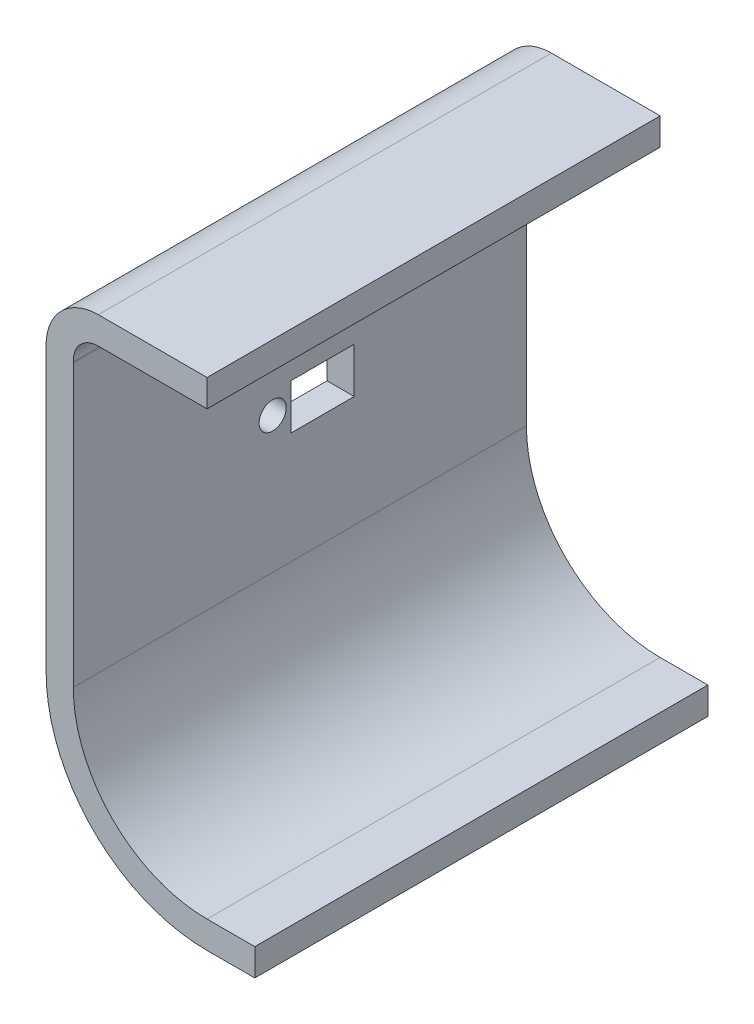
ISO-10303-21;
HEADER;
FILE_DESCRIPTION(('STEP AP214'),'2;1');
FILE_NAME('part.step','',(''),(''),'','','');
FILE_SCHEMA(('AUTOMOTIVE_DESIGN { 1 0 10303 214 1 1 1 1 }'));
ENDSEC;
DATA;
#1=APPLICATION_CONTEXT('core data for automotive mechanical design processes');
#2=APPLICATION_PROTOCOL_DEFINITION('international standard','automotive_design',2000,#1);
#3=PRODUCT_CONTEXT('',#1,'mechanical');
#4=PRODUCT('Part','Part','',(#3));
#5=PRODUCT_RELATED_PRODUCT_CATEGORY('part','',(#4));
#6=PRODUCT_DEFINITION_FORMATION('','',#4);
#7=PRODUCT_DEFINITION_CONTEXT('part definition',#1,'design');
#8=PRODUCT_DEFINITION('design','',#6,#7);
#9=PRODUCT_DEFINITION_SHAPE('','',#8);
#10=(LENGTH_UNIT() NAMED_UNIT(*) SI_UNIT(.MILLI.,.METRE.));
#11=(NAMED_UNIT(*) PLANE_ANGLE_UNIT() SI_UNIT($,.RADIAN.));
#12=(NAMED_UNIT(*) SI_UNIT($,.STERADIAN.) SOLID_ANGLE_UNIT());
#13=UNCERTAINTY_MEASURE_WITH_UNIT(LENGTH_MEASURE(1.E-05),#10,'distance_accuracy_value','');
#14=(GEOMETRIC_REPRESENTATION_CONTEXT(3) GLOBAL_UNCERTAINTY_ASSIGNED_CONTEXT((#13)) GLOBAL_UNIT_ASSIGNED_CONTEXT((#10,
#11,#12)) REPRESENTATION_CONTEXT('',''));
#15=CARTESIAN_POINT('',(0.,0.,0.));
#16=DIRECTION('',(0.,0.,1.));
#17=DIRECTION('',(1.,0.,0.));
#18=AXIS2_PLACEMENT_3D('',#15,#16,#17);
#19=CARTESIAN_POINT('',(-1.5,0.,50.));
#20=DIRECTION('',(-1.,0.,0.));
#21=DIRECTION('',(0.,0.,1.));
#22=AXIS2_PLACEMENT_3D('',#19,#20,#21);
#23=PLANE('',#22);
#24=DIRECTION('',(0.,-1.,0.));
#25=VECTOR('',#24,1.);
#26=CARTESIAN_POINT('',(-1.5,5.8,20.));
#27=LINE('',#26,#25);
#28=CARTESIAN_POINT('',(-1.5,10.8,20.));
#29=VERTEX_POINT('',#28);
#30=CARTESIAN_POINT('',(-1.5,5.8,20.));
#31=VERTEX_POINT('',#30);
#32=EDGE_CURVE('E49',#29,#31,#27,.T.);
#33=ORIENTED_EDGE('',*,*,#32,.F.);
#34=DIRECTION('',(0.,0.,-1.));
#35=VECTOR('',#34,1.);
#36=CARTESIAN_POINT('',(-1.5,10.8,32.));
#37=LINE('',#36,#35);
#38=CARTESIAN_POINT('',(-1.5,10.8,32.));
#39=VERTEX_POINT('',#38);
#40=EDGE_CURVE('E195',#39,#29,#37,.T.);
#41=ORIENTED_EDGE('',*,*,#40,.F.);
#42=DIRECTION('',(0.,1.,0.));
#43=VECTOR('',#42,1.);
#44=CARTESIAN_POINT('',(-1.5,5.8,32.));
#45=LINE('',#44,#43);
#46=CARTESIAN_POINT('',(-1.5,5.8,32.));
#47=VERTEX_POINT('',#46);
#48=EDGE_CURVE('E180',#47,#39,#45,.T.);
#49=ORIENTED_EDGE('',*,*,#48,.F.);
#50=DIRECTION('',(0.,0.,1.));
#51=VECTOR('',#50,1.);
#52=CARTESIAN_POINT('',(-1.5,5.8,32.));
#53=LINE('',#52,#51);
#54=EDGE_CURVE('E189',#31,#47,#53,.T.);
#55=ORIENTED_EDGE('',*,*,#54,.F.);
#56=EDGE_LOOP('',(#33,#41,#49,#55));
#57=FACE_BOUND('',#56,.T.);
#58=DIRECTION('',(0.,-1.,0.));
#59=VECTOR('',#58,1.);
#60=CARTESIAN_POINT('',(-1.5,-3.2,19.));
#61=LINE('',#60,#59);
#62=CARTESIAN_POINT('',(-1.5,1.8,19.));
#63=VERTEX_POINT('',#62);
#64=CARTESIAN_POINT('',(-1.5,-3.2,19.));
#65=VERTEX_POINT('',#64);
#66=EDGE_CURVE('E202',#63,#65,#61,.T.);
#67=ORIENTED_EDGE('',*,*,#66,.F.);
#68=DIRECTION('',(0.,0.,-1.));
#69=VECTOR('',#68,1.);
#70=CARTESIAN_POINT('',(-1.5,1.8,26.));
#71=LINE('',#70,#69);
#72=CARTESIAN_POINT('',(-1.5,1.8,26.));
#73=VERTEX_POINT('',#72);
#74=EDGE_CURVE('E212',#73,#63,#71,.T.);
#75=ORIENTED_EDGE('',*,*,#74,.F.);
#76=DIRECTION('',(0.,1.,0.));
#77=VECTOR('',#76,1.);
#78=CARTESIAN_POINT('',(-1.5,-3.2,26.));
#79=LINE('',#78,#77);
#80=CARTESIAN_POINT('',(-1.5,-3.2,26.));
#81=VERTEX_POINT('',#80);
#82=EDGE_CURVE('E209',#81,#73,#79,.T.);
#83=ORIENTED_EDGE('',*,*,#82,.F.);
#84=DIRECTION('',(0.,0.,1.));
#85=VECTOR('',#84,1.);
#86=CARTESIAN_POINT('',(-1.5,-3.2,26.));
#87=LINE('',#86,#85);
#88=EDGE_CURVE('E206',#65,#81,#87,.T.);
#89=ORIENTED_EDGE('',*,*,#88,.F.);
#90=EDGE_LOOP('',(#67,#75,#83,#89));
#91=FACE_BOUND('',#90,.T.);
#92=CARTESIAN_POINT('',(-1.5,-0.5,28.));
#93=DIRECTION('',(-1.,0.,0.));
#94=DIRECTION('',(0.,0.,1.));
#95=AXIS2_PLACEMENT_3D('',#92,#93,#94);
#96=CIRCLE('',#95,1.5);
#97=CARTESIAN_POINT('',(-1.5,-0.5,29.5));
#98=VERTEX_POINT('',#97);
#99=EDGE_CURVE('E218',#98,#98,#96,.T.);
#100=ORIENTED_EDGE('',*,*,#99,.F.);
#101=EDGE_LOOP('',(#100));
#102=FACE_BOUND('',#101,.T.);
#103=DIRECTION('',(0.,1.,0.));
#104=VECTOR('',#103,1.);
#105=CARTESIAN_POINT('',(-1.5,0.,0.));
#106=LINE('',#105,#104);
#107=CARTESIAN_POINT('',(-1.5,-15.5,0.));
#108=VERTEX_POINT('',#107);
#109=CARTESIAN_POINT('',(-1.5,15.5,0.));
#110=VERTEX_POINT('',#109);
#111=EDGE_CURVE('E266',#108,#110,#106,.T.);
#112=ORIENTED_EDGE('',*,*,#111,.F.);
#113=DIRECTION('',(0.,0.,-1.));
#114=VECTOR('',#113,1.);
#115=CARTESIAN_POINT('',(-1.5,-15.5,50.));
#116=LINE('',#115,#114);
#117=CARTESIAN_POINT('',(-1.5,-15.5,50.));
#118=VERTEX_POINT('',#117);
#119=EDGE_CURVE('E327',#118,#108,#116,.T.);
#120=ORIENTED_EDGE('',*,*,#119,.F.);
#121=DIRECTION('',(0.,1.,0.));
#122=VECTOR('',#121,1.);
#123=CARTESIAN_POINT('',(-1.5,0.,50.));
#124=LINE('',#123,#122);
#125=CARTESIAN_POINT('',(-1.5,15.5,50.));
#126=VERTEX_POINT('',#125);
#127=EDGE_CURVE('E228',#118,#126,#124,.T.);
#128=ORIENTED_EDGE('',*,*,#127,.T.);
#129=DIRECTION('',(0.,0.,-1.));
#130=VECTOR('',#129,1.);
#131=CARTESIAN_POINT('',(-1.5,15.5,50.));
#132=LINE('',#131,#130);
#133=EDGE_CURVE('E265',#126,#110,#132,.T.);
#134=ORIENTED_EDGE('',*,*,#133,.T.);
#135=EDGE_LOOP('',(#112,#120,#128,#134));
#136=FACE_BOUND('',#135,.T.);
#137=ADVANCED_FACE('F35',(#57,#91,#102,#136),#23,.T.);
#138=CARTESIAN_POINT('',(16.2600807048279,-15.5,50.));
#139=DIRECTION('',(0.,0.,-1.));
#140=DIRECTION('',(-1.,0.,0.));
#141=AXIS2_PLACEMENT_3D('',#138,#139,#140);
#142=CYLINDRICAL_SURFACE('',#141,17.7600807048279);
#143=CARTESIAN_POINT('',(16.2600807048279,-15.5,0.));
#144=DIRECTION('',(0.,0.,1.));
#145=DIRECTION('',(1.,0.,0.));
#146=AXIS2_PLACEMENT_3D('',#143,#144,#145);
#147=CIRCLE('',#146,17.7600807048279);
#148=CARTESIAN_POINT('',(16.2600807048279,-33.2600807048279,0.));
#149=VERTEX_POINT('',#148);
#150=EDGE_CURVE('E269',#108,#149,#147,.T.);
#151=ORIENTED_EDGE('',*,*,#150,.T.);
#152=DIRECTION('',(0.,0.,-1.));
#153=VECTOR('',#152,1.);
#154=CARTESIAN_POINT('',(16.2600807048279,-33.2600807048279,50.));
#155=LINE('',#154,#153);
#156=CARTESIAN_POINT('',(16.2600807048279,-33.2600807048279,50.));
#157=VERTEX_POINT('',#156);
#158=EDGE_CURVE('E325',#157,#149,#155,.T.);
#159=ORIENTED_EDGE('',*,*,#158,.F.);
#160=CARTESIAN_POINT('',(16.2600807048279,-15.5,50.));
#161=DIRECTION('',(0.,0.,1.));
#162=DIRECTION('',(1.,0.,0.));
#163=AXIS2_PLACEMENT_3D('',#160,#161,#162);
#164=CIRCLE('',#163,17.7600807048279);
#165=EDGE_CURVE('E231',#118,#157,#164,.T.);
#166=ORIENTED_EDGE('',*,*,#165,.F.);
#167=ORIENTED_EDGE('',*,*,#119,.T.);
#168=EDGE_LOOP('',(#151,#159,#166,#167));
#169=FACE_BOUND('',#168,.T.);
#170=ADVANCED_FACE('F367',(#169),#142,.T.);
#171=CARTESIAN_POINT('',(0.,-33.2600807048279,50.));
#172=DIRECTION('',(0.,-1.,0.));
#173=DIRECTION('',(1.,0.,0.));
#174=AXIS2_PLACEMENT_3D('',#171,#172,#173);
#175=PLANE('',#174);
#176=DIRECTION('',(-1.,0.,0.));
#177=VECTOR('',#176,1.);
#178=CARTESIAN_POINT('',(0.,-33.2600807048279,0.));
#179=LINE('',#178,#177);
#180=CARTESIAN_POINT('',(21.5251546355191,-33.2600807048279,0.));
#181=VERTEX_POINT('',#180);
#182=EDGE_CURVE('E272',#181,#149,#179,.T.);
#183=ORIENTED_EDGE('',*,*,#182,.F.);
#184=DIRECTION('',(0.,0.,-1.));
#185=VECTOR('',#184,1.);
#186=CARTESIAN_POINT('',(21.5251546355191,-33.2600807048279,50.));
#187=LINE('',#186,#185);
#188=CARTESIAN_POINT('',(21.5251546355191,-33.2600807048279,50.));
#189=VERTEX_POINT('',#188);
#190=EDGE_CURVE('E323',#189,#181,#187,.T.);
#191=ORIENTED_EDGE('',*,*,#190,.F.);
#192=DIRECTION('',(-1.,0.,0.));
#193=VECTOR('',#192,1.);
#194=CARTESIAN_POINT('',(0.,-33.2600807048279,50.));
#195=LINE('',#194,#193);
#196=EDGE_CURVE('E234',#189,#157,#195,.T.);
#197=ORIENTED_EDGE('',*,*,#196,.T.);
#198=ORIENTED_EDGE('',*,*,#158,.T.);
#199=EDGE_LOOP('',(#183,#191,#197,#198));
#200=FACE_BOUND('',#199,.T.);
#201=ADVANCED_FACE('F371',(#200),#175,.T.);
#202=CARTESIAN_POINT('',(21.5251546355191,0.,50.));
#203=DIRECTION('',(1.,0.,0.));
#204=DIRECTION('',(0.,0.,-1.));
#205=AXIS2_PLACEMENT_3D('',#202,#203,#204);
#206=PLANE('',#205);
#207=DIRECTION('',(0.,-1.,0.));
#208=VECTOR('',#207,1.);
#209=CARTESIAN_POINT('',(21.5251546355191,0.,0.));
#210=LINE('',#209,#208);
#211=CARTESIAN_POINT('',(21.5251546355191,-30.2600807048279,0.));
#212=VERTEX_POINT('',#211);
#213=EDGE_CURVE('E275',#212,#181,#210,.T.);
#214=ORIENTED_EDGE('',*,*,#213,.F.);
#215=DIRECTION('',(0.,0.,-1.));
#216=VECTOR('',#215,1.);
#217=CARTESIAN_POINT('',(21.5251546355191,-30.2600807048279,50.));
#218=LINE('',#217,#216);
#219=CARTESIAN_POINT('',(21.5251546355191,-30.2600807048279,50.));
#220=VERTEX_POINT('',#219);
#221=EDGE_CURVE('E321',#220,#212,#218,.T.);
#222=ORIENTED_EDGE('',*,*,#221,.F.);
#223=DIRECTION('',(0.,-1.,0.));
#224=VECTOR('',#223,1.);
#225=CARTESIAN_POINT('',(21.5251546355191,0.,50.));
#226=LINE('',#225,#224);
#227=EDGE_CURVE('E237',#220,#189,#226,.T.);
#228=ORIENTED_EDGE('',*,*,#227,.T.);
#229=ORIENTED_EDGE('',*,*,#190,.T.);
#230=EDGE_LOOP('',(#214,#222,#228,#229));
#231=FACE_BOUND('',#230,.T.);
#232=ADVANCED_FACE('F376',(#231),#206,.T.);
#233=CARTESIAN_POINT('',(0.,-30.260080704828,50.));
#234=DIRECTION('',(0.,1.,0.));
#235=DIRECTION('',(-1.,0.,0.));
#236=AXIS2_PLACEMENT_3D('',#233,#234,#235);
#237=PLANE('',#236);
#238=DIRECTION('',(1.,0.,0.));
#239=VECTOR('',#238,1.);
#240=CARTESIAN_POINT('',(0.,-30.260080704828,0.));
#241=LINE('',#240,#239);
#242=CARTESIAN_POINT('',(16.2600807048279,-30.260080704828,0.));
#243=VERTEX_POINT('',#242);
#244=EDGE_CURVE('E278',#243,#212,#241,.T.);
#245=ORIENTED_EDGE('',*,*,#244,.F.);
#246=DIRECTION('',(0.,0.,-1.));
#247=VECTOR('',#246,1.);
#248=CARTESIAN_POINT('',(16.2600807048279,-30.260080704828,50.));
#249=LINE('',#248,#247);
#250=CARTESIAN_POINT('',(16.2600807048279,-30.260080704828,50.));
#251=VERTEX_POINT('',#250);
#252=EDGE_CURVE('E319',#251,#243,#249,.T.);
#253=ORIENTED_EDGE('',*,*,#252,.F.);
#254=DIRECTION('',(1.,0.,0.));
#255=VECTOR('',#254,1.);
#256=CARTESIAN_POINT('',(0.,-30.260080704828,50.));
#257=LINE('',#256,#255);
#258=EDGE_CURVE('E240',#251,#220,#257,.T.);
#259=ORIENTED_EDGE('',*,*,#258,.T.);
#260=ORIENTED_EDGE('',*,*,#221,.T.);
#261=EDGE_LOOP('',(#245,#253,#259,#260));
#262=FACE_BOUND('',#261,.T.);
#263=ADVANCED_FACE('F382',(#262),#237,.T.);
#264=CARTESIAN_POINT('',(16.2600807048279,-15.5,50.));
#265=DIRECTION('',(0.,0.,-1.));
#266=DIRECTION('',(-1.,0.,0.));
#267=AXIS2_PLACEMENT_3D('',#264,#265,#266);
#268=CYLINDRICAL_SURFACE('',#267,14.760080704828);
#269=CARTESIAN_POINT('',(16.2600807048279,-15.5,0.));
#270=DIRECTION('',(0.,0.,1.));
#271=DIRECTION('',(1.,0.,0.));
#272=AXIS2_PLACEMENT_3D('',#269,#270,#271);
#273=CIRCLE('',#272,14.760080704828);
#274=CARTESIAN_POINT('',(1.5,-15.5,0.));
#275=VERTEX_POINT('',#274);
#276=EDGE_CURVE('E281',#275,#243,#273,.T.);
#277=ORIENTED_EDGE('',*,*,#276,.F.);
#278=DIRECTION('',(0.,0.,-1.));
#279=VECTOR('',#278,1.);
#280=CARTESIAN_POINT('',(1.5,-15.5,50.));
#281=LINE('',#280,#279);
#282=CARTESIAN_POINT('',(1.5,-15.5,50.));
#283=VERTEX_POINT('',#282);
#284=EDGE_CURVE('E317',#283,#275,#281,.T.);
#285=ORIENTED_EDGE('',*,*,#284,.F.);
#286=CARTESIAN_POINT('',(16.2600807048279,-15.5,50.));
#287=DIRECTION('',(0.,0.,1.));
#288=DIRECTION('',(1.,0.,0.));
#289=AXIS2_PLACEMENT_3D('',#286,#287,#288);
#290=CIRCLE('',#289,14.760080704828);
#291=EDGE_CURVE('E243',#283,#251,#290,.T.);
#292=ORIENTED_EDGE('',*,*,#291,.T.);
#293=ORIENTED_EDGE('',*,*,#252,.T.);
#294=EDGE_LOOP('',(#277,#285,#292,#293));
#295=FACE_BOUND('',#294,.T.);
#296=ADVANCED_FACE('F386',(#295),#268,.F.);
#297=CARTESIAN_POINT('',(1.5,0.,50.));
#298=DIRECTION('',(-1.,0.,0.));
#299=DIRECTION('',(0.,0.,1.));
#300=AXIS2_PLACEMENT_3D('',#297,#298,#299);
#301=PLANE('',#300);
#302=DIRECTION('',(0.,0.,-1.));
#303=VECTOR('',#302,1.);
#304=CARTESIAN_POINT('',(1.5,10.8,50.));
#305=LINE('',#304,#303);
#306=CARTESIAN_POINT('',(1.5,10.8,32.));
#307=VERTEX_POINT('',#306);
#308=CARTESIAN_POINT('',(1.5,10.8,20.));
#309=VERTEX_POINT('',#308);
#310=EDGE_CURVE('E42',#307,#309,#305,.T.);
#311=ORIENTED_EDGE('',*,*,#310,.T.);
#312=DIRECTION('',(0.,-1.,0.));
#313=VECTOR('',#312,1.);
#314=CARTESIAN_POINT('',(1.5,0.,20.));
#315=LINE('',#314,#313);
#316=CARTESIAN_POINT('',(1.5,5.8,20.));
#317=VERTEX_POINT('',#316);
#318=EDGE_CURVE('E11',#309,#317,#315,.T.);
#319=ORIENTED_EDGE('',*,*,#318,.T.);
#320=DIRECTION('',(0.,0.,1.));
#321=VECTOR('',#320,1.);
#322=CARTESIAN_POINT('',(1.5,5.8,50.));
#323=LINE('',#322,#321);
#324=CARTESIAN_POINT('',(1.5,5.8,32.));
#325=VERTEX_POINT('',#324);
#326=EDGE_CURVE('E343',#317,#325,#323,.T.);
#327=ORIENTED_EDGE('',*,*,#326,.T.);
#328=DIRECTION('',(0.,1.,0.));
#329=VECTOR('',#328,1.);
#330=CARTESIAN_POINT('',(1.5,0.,32.));
#331=LINE('',#330,#329);
#332=EDGE_CURVE('E183',#325,#307,#331,.T.);
#333=ORIENTED_EDGE('',*,*,#332,.T.);
#334=EDGE_LOOP('',(#311,#319,#327,#333));
#335=FACE_BOUND('',#334,.T.);
#336=DIRECTION('',(0.,0.,-1.));
#337=VECTOR('',#336,1.);
#338=CARTESIAN_POINT('',(1.5,1.8,50.));
#339=LINE('',#338,#337);
#340=CARTESIAN_POINT('',(1.5,1.8,26.));
#341=VERTEX_POINT('',#340);
#342=CARTESIAN_POINT('',(1.5,1.8,19.));
#343=VERTEX_POINT('',#342);
#344=EDGE_CURVE('E337',#341,#343,#339,.T.);
#345=ORIENTED_EDGE('',*,*,#344,.T.);
#346=DIRECTION('',(0.,-1.,0.));
#347=VECTOR('',#346,1.);
#348=CARTESIAN_POINT('',(1.5,0.,19.));
#349=LINE('',#348,#347);
#350=CARTESIAN_POINT('',(1.5,-3.2,19.));
#351=VERTEX_POINT('',#350);
#352=EDGE_CURVE('E340',#343,#351,#349,.T.);
#353=ORIENTED_EDGE('',*,*,#352,.T.);
#354=DIRECTION('',(0.,0.,1.));
#355=VECTOR('',#354,1.);
#356=CARTESIAN_POINT('',(1.5,-3.2,50.));
#357=LINE('',#356,#355);
#358=CARTESIAN_POINT('',(1.5,-3.2,26.));
#359=VERTEX_POINT('',#358);
#360=EDGE_CURVE('E329',#351,#359,#357,.T.);
#361=ORIENTED_EDGE('',*,*,#360,.T.);
#362=DIRECTION('',(0.,1.,0.));
#363=VECTOR('',#362,1.);
#364=CARTESIAN_POINT('',(1.5,0.,26.));
#365=LINE('',#364,#363);
#366=EDGE_CURVE('E334',#359,#341,#365,.T.);
#367=ORIENTED_EDGE('',*,*,#366,.T.);
#368=EDGE_LOOP('',(#345,#353,#361,#367));
#369=FACE_BOUND('',#368,.T.);
#370=CARTESIAN_POINT('',(1.5,-0.5,28.));
#371=DIRECTION('',(-1.,0.,0.));
#372=DIRECTION('',(0.,0.,1.));
#373=AXIS2_PLACEMENT_3D('',#370,#371,#372);
#374=CIRCLE('',#373,1.5);
#375=CARTESIAN_POINT('',(1.5,-0.5,29.5));
#376=VERTEX_POINT('',#375);
#377=EDGE_CURVE('E227',#376,#376,#374,.T.);
#378=ORIENTED_EDGE('',*,*,#377,.T.);
#379=EDGE_LOOP('',(#378));
#380=FACE_BOUND('',#379,.T.);
#381=DIRECTION('',(0.,1.,0.));
#382=VECTOR('',#381,1.);
#383=CARTESIAN_POINT('',(1.5,0.,0.));
#384=LINE('',#383,#382);
#385=CARTESIAN_POINT('',(1.5,15.5,0.));
#386=VERTEX_POINT('',#385);
#387=EDGE_CURVE('E284',#275,#386,#384,.T.);
#388=ORIENTED_EDGE('',*,*,#387,.T.);
#389=DIRECTION('',(0.,0.,-1.));
#390=VECTOR('',#389,1.);
#391=CARTESIAN_POINT('',(1.5,15.5,50.));
#392=LINE('',#391,#390);
#393=CARTESIAN_POINT('',(1.5,15.5,50.));
#394=VERTEX_POINT('',#393);
#395=EDGE_CURVE('E315',#394,#386,#392,.T.);
#396=ORIENTED_EDGE('',*,*,#395,.F.);
#397=DIRECTION('',(0.,1.,0.));
#398=VECTOR('',#397,1.);
#399=CARTESIAN_POINT('',(1.5,0.,50.));
#400=LINE('',#399,#398);
#401=EDGE_CURVE('E246',#283,#394,#400,.T.);
#402=ORIENTED_EDGE('',*,*,#401,.F.);
#403=ORIENTED_EDGE('',*,*,#284,.T.);
#404=EDGE_LOOP('',(#388,#396,#402,#403));
#405=FACE_BOUND('',#404,.T.);
#406=ADVANCED_FACE('F347',(#335,#369,#380,#405),#301,.F.);
#407=CARTESIAN_POINT('',(1.81546238056432,0.0370375395959421,50.));
#408=DIRECTION('',(0.999791961261198,0.0203969163720186,0.));
#409=DIRECTION('',(-0.0203969163720186,0.999791961261198,0.));
#410=AXIS2_PLACEMENT_3D('',#407,#408,#409);
#411=PLANE('',#410);
#412=DIRECTION('',(0.0203969163720186,-0.999791961261198,0.));
#413=VECTOR('',#412,1.);
#414=CARTESIAN_POINT('',(1.81546238056432,0.0370375395959421,0.));
#415=LINE('',#414,#413);
#416=CARTESIAN_POINT('',(1.49750379481508,15.6223560381395,0.));
#417=VERTEX_POINT('',#416);
#418=EDGE_CURVE('E287',#417,#386,#415,.T.);
#419=ORIENTED_EDGE('',*,*,#418,.F.);
#420=DIRECTION('',(0.,0.,-1.));
#421=VECTOR('',#420,1.);
#422=CARTESIAN_POINT('',(1.49750379481508,15.6223560381395,50.));
#423=LINE('',#422,#421);
#424=CARTESIAN_POINT('',(1.49750379481508,15.6223560381395,50.));
#425=VERTEX_POINT('',#424);
#426=EDGE_CURVE('E313',#425,#417,#423,.T.);
#427=ORIENTED_EDGE('',*,*,#426,.F.);
#428=DIRECTION('',(0.0203969163720186,-0.999791961261198,0.));
#429=VECTOR('',#428,1.);
#430=CARTESIAN_POINT('',(1.81546238056432,0.0370375395959421,50.));
#431=LINE('',#430,#429);
#432=EDGE_CURVE('E248',#425,#394,#431,.T.);
#433=ORIENTED_EDGE('',*,*,#432,.T.);
#434=ORIENTED_EDGE('',*,*,#395,.T.);
#435=EDGE_LOOP('',(#419,#427,#433,#434));
#436=FACE_BOUND('',#435,.T.);
#437=ADVANCED_FACE('F393',(#436),#411,.T.);
#438=CARTESIAN_POINT('',(4.26008070482794,15.7351225228224,50.));
#439=DIRECTION('',(0.,0.,-1.));
#440=DIRECTION('',(-1.,0.,0.));
#441=AXIS2_PLACEMENT_3D('',#438,#439,#440);
#442=CYLINDRICAL_SURFACE('',#441,2.76487747717759);
#443=CARTESIAN_POINT('',(4.26008070482794,15.7351225228224,0.));
#444=DIRECTION('',(0.,0.,1.));
#445=DIRECTION('',(1.,0.,0.));
#446=AXIS2_PLACEMENT_3D('',#443,#444,#445);
#447=CIRCLE('',#446,2.76487747717759);
#448=CARTESIAN_POINT('',(4.26008070482794,18.5,0.));
#449=VERTEX_POINT('',#448);
#450=EDGE_CURVE('E290',#417,#449,#447,.F.);
#451=ORIENTED_EDGE('',*,*,#450,.T.);
#452=DIRECTION('',(0.,0.,-1.));
#453=VECTOR('',#452,1.);
#454=CARTESIAN_POINT('',(4.26008070482794,18.5,50.));
#455=LINE('',#454,#453);
#456=CARTESIAN_POINT('',(4.26008070482794,18.5,50.));
#457=VERTEX_POINT('',#456);
#458=EDGE_CURVE('E311',#457,#449,#455,.T.);
#459=ORIENTED_EDGE('',*,*,#458,.F.);
#460=CARTESIAN_POINT('',(4.26008070482794,15.7351225228224,50.));
#461=DIRECTION('',(0.,0.,1.));
#462=DIRECTION('',(1.,0.,0.));
#463=AXIS2_PLACEMENT_3D('',#460,#461,#462);
#464=CIRCLE('',#463,2.76487747717759);
#465=EDGE_CURVE('E251',#425,#457,#464,.F.);
#466=ORIENTED_EDGE('',*,*,#465,.F.);
#467=ORIENTED_EDGE('',*,*,#426,.T.);
#468=EDGE_LOOP('',(#451,#459,#466,#467));
#469=FACE_BOUND('',#468,.T.);
#470=ADVANCED_FACE('F396',(#469),#442,.F.);
#471=CARTESIAN_POINT('',(0.,18.5,50.));
#472=DIRECTION('',(0.,-1.,0.));
#473=DIRECTION('',(1.,0.,0.));
#474=AXIS2_PLACEMENT_3D('',#471,#472,#473);
#475=PLANE('',#474);
#476=DIRECTION('',(-1.,0.,0.));
#477=VECTOR('',#476,1.);
#478=CARTESIAN_POINT('',(0.,18.5,0.));
#479=LINE('',#478,#477);
#480=CARTESIAN_POINT('',(16.2600807048279,18.5,0.));
#481=VERTEX_POINT('',#480);
#482=EDGE_CURVE('E293',#481,#449,#479,.T.);
#483=ORIENTED_EDGE('',*,*,#482,.F.);
#484=DIRECTION('',(0.,0.,-1.));
#485=VECTOR('',#484,1.);
#486=CARTESIAN_POINT('',(16.2600807048279,18.5,50.));
#487=LINE('',#486,#485);
#488=CARTESIAN_POINT('',(16.2600807048279,18.5,50.));
#489=VERTEX_POINT('',#488);
#490=EDGE_CURVE('E309',#489,#481,#487,.T.);
#491=ORIENTED_EDGE('',*,*,#490,.F.);
#492=DIRECTION('',(-1.,0.,0.));
#493=VECTOR('',#492,1.);
#494=CARTESIAN_POINT('',(0.,18.5,50.));
#495=LINE('',#494,#493);
#496=EDGE_CURVE('E253',#489,#457,#495,.T.);
#497=ORIENTED_EDGE('',*,*,#496,.T.);
#498=ORIENTED_EDGE('',*,*,#458,.T.);
#499=EDGE_LOOP('',(#483,#491,#497,#498));
#500=FACE_BOUND('',#499,.T.);
#501=ADVANCED_FACE('F400',(#500),#475,.T.);
#502=CARTESIAN_POINT('',(16.260080704828,0.,50.));
#503=DIRECTION('',(1.,0.,0.));
#504=DIRECTION('',(0.,1.,0.));
#505=AXIS2_PLACEMENT_3D('',#502,#503,#504);
#506=PLANE('',#505);
#507=DIRECTION('',(0.,-1.,0.));
#508=VECTOR('',#507,1.);
#509=CARTESIAN_POINT('',(16.260080704828,0.,0.));
#510=LINE('',#509,#508);
#511=CARTESIAN_POINT('',(16.2600807048279,21.5,0.));
#512=VERTEX_POINT('',#511);
#513=EDGE_CURVE('E296',#512,#481,#510,.T.);
#514=ORIENTED_EDGE('',*,*,#513,.F.);
#515=DIRECTION('',(0.,0.,-1.));
#516=VECTOR('',#515,1.);
#517=CARTESIAN_POINT('',(16.2600807048279,21.5,50.));
#518=LINE('',#517,#516);
#519=CARTESIAN_POINT('',(16.2600807048279,21.5,50.));
#520=VERTEX_POINT('',#519);
#521=EDGE_CURVE('E307',#520,#512,#518,.T.);
#522=ORIENTED_EDGE('',*,*,#521,.F.);
#523=DIRECTION('',(0.,-1.,0.));
#524=VECTOR('',#523,1.);
#525=CARTESIAN_POINT('',(16.260080704828,0.,50.));
#526=LINE('',#525,#524);
#527=EDGE_CURVE('E256',#520,#489,#526,.T.);
#528=ORIENTED_EDGE('',*,*,#527,.T.);
#529=ORIENTED_EDGE('',*,*,#490,.T.);
#530=EDGE_LOOP('',(#514,#522,#528,#529));
#531=FACE_BOUND('',#530,.T.);
#532=ADVANCED_FACE('F404',(#531),#506,.T.);
#533=CARTESIAN_POINT('',(0.,21.5,50.));
#534=DIRECTION('',(0.,1.,0.));
#535=DIRECTION('',(0.,0.,1.));
#536=AXIS2_PLACEMENT_3D('',#533,#534,#535);
#537=PLANE('',#536);
#538=DIRECTION('',(1.,0.,0.));
#539=VECTOR('',#538,1.);
#540=CARTESIAN_POINT('',(0.,21.5,0.));
#541=LINE('',#540,#539);
#542=CARTESIAN_POINT('',(4.26008070482794,21.5,0.));
#543=VERTEX_POINT('',#542);
#544=EDGE_CURVE('E299',#543,#512,#541,.T.);
#545=ORIENTED_EDGE('',*,*,#544,.F.);
#546=DIRECTION('',(0.,0.,-1.));
#547=VECTOR('',#546,1.);
#548=CARTESIAN_POINT('',(4.26008070482794,21.5,50.));
#549=LINE('',#548,#547);
#550=CARTESIAN_POINT('',(4.26008070482794,21.5,50.));
#551=VERTEX_POINT('',#550);
#552=EDGE_CURVE('E305',#551,#543,#549,.T.);
#553=ORIENTED_EDGE('',*,*,#552,.F.);
#554=DIRECTION('',(1.,0.,0.));
#555=VECTOR('',#554,1.);
#556=CARTESIAN_POINT('',(0.,21.5,50.));
#557=LINE('',#556,#555);
#558=EDGE_CURVE('E259',#551,#520,#557,.T.);
#559=ORIENTED_EDGE('',*,*,#558,.T.);
#560=ORIENTED_EDGE('',*,*,#521,.T.);
#561=EDGE_LOOP('',(#545,#553,#559,#560));
#562=FACE_BOUND('',#561,.T.);
#563=ADVANCED_FACE('F408',(#562),#537,.T.);
#564=CARTESIAN_POINT('',(4.26008070482794,15.7351225228224,50.));
#565=DIRECTION('',(0.,0.,-1.));
#566=DIRECTION('',(-1.,0.,0.));
#567=AXIS2_PLACEMENT_3D('',#564,#565,#566);
#568=CYLINDRICAL_SURFACE('',#567,5.76487747717759);
#569=CARTESIAN_POINT('',(4.26008070482794,15.7351225228224,0.));
#570=DIRECTION('',(0.,0.,1.));
#571=DIRECTION('',(1.,0.,0.));
#572=AXIS2_PLACEMENT_3D('',#569,#570,#571);
#573=CIRCLE('',#572,5.76487747717759);
#574=EDGE_CURVE('E232',#110,#543,#573,.F.);
#575=ORIENTED_EDGE('',*,*,#574,.F.);
#576=ORIENTED_EDGE('',*,*,#133,.F.);
#577=CARTESIAN_POINT('',(4.26008070482794,15.7351225228224,50.));
#578=DIRECTION('',(0.,0.,1.));
#579=DIRECTION('',(1.,0.,0.));
#580=AXIS2_PLACEMENT_3D('',#577,#578,#579);
#581=CIRCLE('',#580,5.76487747717759);
#582=EDGE_CURVE('E262',#126,#551,#581,.F.);
#583=ORIENTED_EDGE('',*,*,#582,.T.);
#584=ORIENTED_EDGE('',*,*,#552,.T.);
#585=EDGE_LOOP('',(#575,#576,#583,#584));
#586=FACE_BOUND('',#585,.T.);
#587=ADVANCED_FACE('F412',(#586),#568,.T.);
#588=CARTESIAN_POINT('',(0.,0.,50.));
#589=DIRECTION('',(0.,0.,1.));
#590=DIRECTION('',(1.,0.,0.));
#591=AXIS2_PLACEMENT_3D('',#588,#589,#590);
#592=PLANE('',#591);
#593=ORIENTED_EDGE('',*,*,#127,.F.);
#594=ORIENTED_EDGE('',*,*,#165,.T.);
#595=ORIENTED_EDGE('',*,*,#196,.F.);
#596=ORIENTED_EDGE('',*,*,#227,.F.);
#597=ORIENTED_EDGE('',*,*,#258,.F.);
#598=ORIENTED_EDGE('',*,*,#291,.F.);
#599=ORIENTED_EDGE('',*,*,#401,.T.);
#600=ORIENTED_EDGE('',*,*,#432,.F.);
#601=ORIENTED_EDGE('',*,*,#465,.T.);
#602=ORIENTED_EDGE('',*,*,#496,.F.);
#603=ORIENTED_EDGE('',*,*,#527,.F.);
#604=ORIENTED_EDGE('',*,*,#558,.F.);
#605=ORIENTED_EDGE('',*,*,#582,.F.);
#606=EDGE_LOOP('',(#593,#594,#595,#596,#597,#598,#599,#600,#601,#602,#603,#604,#605));
#607=FACE_BOUND('',#606,.T.);
#608=ADVANCED_FACE('F416',(#607),#592,.T.);
#609=CARTESIAN_POINT('',(0.,0.,0.));
#610=DIRECTION('',(0.,0.,1.));
#611=DIRECTION('',(1.,0.,0.));
#612=AXIS2_PLACEMENT_3D('',#609,#610,#611);
#613=PLANE('',#612);
#614=ORIENTED_EDGE('',*,*,#111,.T.);
#615=ORIENTED_EDGE('',*,*,#574,.T.);
#616=ORIENTED_EDGE('',*,*,#544,.T.);
#617=ORIENTED_EDGE('',*,*,#513,.T.);
#618=ORIENTED_EDGE('',*,*,#482,.T.);
#619=ORIENTED_EDGE('',*,*,#450,.F.);
#620=ORIENTED_EDGE('',*,*,#418,.T.);
#621=ORIENTED_EDGE('',*,*,#387,.F.);
#622=ORIENTED_EDGE('',*,*,#276,.T.);
#623=ORIENTED_EDGE('',*,*,#244,.T.);
#624=ORIENTED_EDGE('',*,*,#213,.T.);
#625=ORIENTED_EDGE('',*,*,#182,.T.);
#626=ORIENTED_EDGE('',*,*,#150,.F.);
#627=EDGE_LOOP('',(#614,#615,#616,#617,#618,#619,#620,#621,#622,#623,#624,#625,#626));
#628=FACE_BOUND('',#627,.T.);
#629=ADVANCED_FACE('F418',(#628),#613,.F.);
#630=CARTESIAN_POINT('',(21.5251546355191,-0.5,28.));
#631=DIRECTION('',(-1.,0.,0.));
#632=DIRECTION('',(0.,0.,1.));
#633=AXIS2_PLACEMENT_3D('',#630,#631,#632);
#634=CYLINDRICAL_SURFACE('',#633,1.5);
#635=ORIENTED_EDGE('',*,*,#99,.T.);
#636=EDGE_LOOP('',(#635));
#637=FACE_BOUND('',#636,.T.);
#638=ORIENTED_EDGE('',*,*,#377,.F.);
#639=EDGE_LOOP('',(#638));
#640=FACE_BOUND('',#639,.T.);
#641=ADVANCED_FACE('F421',(#637,#640),#634,.F.);
#642=CARTESIAN_POINT('',(21.5251546355191,-3.2,19.));
#643=DIRECTION('',(0.,0.,-1.));
#644=DIRECTION('',(-1.,0.,0.));
#645=AXIS2_PLACEMENT_3D('',#642,#643,#644);
#646=PLANE('',#645);
#647=DIRECTION('',(-1.,0.,0.));
#648=VECTOR('',#647,1.);
#649=CARTESIAN_POINT('',(21.5251546355191,1.8,19.));
#650=LINE('',#649,#648);
#651=EDGE_CURVE('E216',#343,#63,#650,.T.);
#652=ORIENTED_EDGE('',*,*,#651,.T.);
#653=ORIENTED_EDGE('',*,*,#66,.T.);
#654=DIRECTION('',(-1.,0.,0.));
#655=VECTOR('',#654,1.);
#656=CARTESIAN_POINT('',(21.5251546355191,-3.2,19.));
#657=LINE('',#656,#655);
#658=EDGE_CURVE('E215',#351,#65,#657,.T.);
#659=ORIENTED_EDGE('',*,*,#658,.F.);
#660=ORIENTED_EDGE('',*,*,#352,.F.);
#661=EDGE_LOOP('',(#652,#653,#659,#660));
#662=FACE_BOUND('',#661,.T.);
#663=ADVANCED_FACE('F428',(#662),#646,.F.);
#664=CARTESIAN_POINT('',(21.5251546355191,1.8,26.));
#665=DIRECTION('',(0.,1.,0.));
#666=DIRECTION('',(0.,0.,1.));
#667=AXIS2_PLACEMENT_3D('',#664,#665,#666);
#668=PLANE('',#667);
#669=DIRECTION('',(-1.,0.,0.));
#670=VECTOR('',#669,1.);
#671=CARTESIAN_POINT('',(21.5251546355191,1.8,26.));
#672=LINE('',#671,#670);
#673=EDGE_CURVE('E219',#341,#73,#672,.T.);
#674=ORIENTED_EDGE('',*,*,#673,.T.);
#675=ORIENTED_EDGE('',*,*,#74,.T.);
#676=ORIENTED_EDGE('',*,*,#651,.F.);
#677=ORIENTED_EDGE('',*,*,#344,.F.);
#678=EDGE_LOOP('',(#674,#675,#676,#677));
#679=FACE_BOUND('',#678,.T.);
#680=ADVANCED_FACE('F431',(#679),#668,.F.);
#681=CARTESIAN_POINT('',(21.5251546355191,-3.2,26.));
#682=DIRECTION('',(0.,0.,1.));
#683=DIRECTION('',(1.,0.,0.));
#684=AXIS2_PLACEMENT_3D('',#681,#682,#683);
#685=PLANE('',#684);
#686=DIRECTION('',(-1.,0.,0.));
#687=VECTOR('',#686,1.);
#688=CARTESIAN_POINT('',(21.5251546355191,-3.2,26.));
#689=LINE('',#688,#687);
#690=EDGE_CURVE('E221',#359,#81,#689,.T.);
#691=ORIENTED_EDGE('',*,*,#690,.T.);
#692=ORIENTED_EDGE('',*,*,#82,.T.);
#693=ORIENTED_EDGE('',*,*,#673,.F.);
#694=ORIENTED_EDGE('',*,*,#366,.F.);
#695=EDGE_LOOP('',(#691,#692,#693,#694));
#696=FACE_BOUND('',#695,.T.);
#697=ADVANCED_FACE('F361',(#696),#685,.F.);
#698=CARTESIAN_POINT('',(21.5251546355191,-3.2,26.));
#699=DIRECTION('',(0.,-1.,0.));
#700=DIRECTION('',(0.,0.,-1.));
#701=AXIS2_PLACEMENT_3D('',#698,#699,#700);
#702=PLANE('',#701);
#703=ORIENTED_EDGE('',*,*,#658,.T.);
#704=ORIENTED_EDGE('',*,*,#88,.T.);
#705=ORIENTED_EDGE('',*,*,#690,.F.);
#706=ORIENTED_EDGE('',*,*,#360,.F.);
#707=EDGE_LOOP('',(#703,#704,#705,#706));
#708=FACE_BOUND('',#707,.T.);
#709=ADVANCED_FACE('F354',(#708),#702,.F.);
#710=CARTESIAN_POINT('',(21.5251546355191,5.8,20.));
#711=DIRECTION('',(0.,0.,-1.));
#712=DIRECTION('',(-1.,0.,0.));
#713=AXIS2_PLACEMENT_3D('',#710,#711,#712);
#714=PLANE('',#713);
#715=DIRECTION('',(-1.,0.,0.));
#716=VECTOR('',#715,1.);
#717=CARTESIAN_POINT('',(21.5251546355191,10.8,20.));
#718=LINE('',#717,#716);
#719=EDGE_CURVE('E200',#309,#29,#718,.T.);
#720=ORIENTED_EDGE('',*,*,#719,.T.);
#721=ORIENTED_EDGE('',*,*,#32,.T.);
#722=DIRECTION('',(-1.,0.,0.));
#723=VECTOR('',#722,1.);
#724=CARTESIAN_POINT('',(21.5251546355191,5.8,20.));
#725=LINE('',#724,#723);
#726=EDGE_CURVE('E186',#317,#31,#725,.T.);
#727=ORIENTED_EDGE('',*,*,#726,.F.);
#728=ORIENTED_EDGE('',*,*,#318,.F.);
#729=EDGE_LOOP('',(#720,#721,#727,#728));
#730=FACE_BOUND('',#729,.T.);
#731=ADVANCED_FACE('F352',(#730),#714,.F.);
#732=CARTESIAN_POINT('',(21.5251546355191,10.8,32.));
#733=DIRECTION('',(0.,1.,0.));
#734=DIRECTION('',(0.,0.,1.));
#735=AXIS2_PLACEMENT_3D('',#732,#733,#734);
#736=PLANE('',#735);
#737=DIRECTION('',(-1.,0.,0.));
#738=VECTOR('',#737,1.);
#739=CARTESIAN_POINT('',(21.5251546355191,10.8,32.));
#740=LINE('',#739,#738);
#741=EDGE_CURVE('E185',#307,#39,#740,.T.);
#742=ORIENTED_EDGE('',*,*,#741,.T.);
#743=ORIENTED_EDGE('',*,*,#40,.T.);
#744=ORIENTED_EDGE('',*,*,#719,.F.);
#745=ORIENTED_EDGE('',*,*,#310,.F.);
#746=EDGE_LOOP('',(#742,#743,#744,#745));
#747=FACE_BOUND('',#746,.T.);
#748=ADVANCED_FACE('F351',(#747),#736,.F.);
#749=CARTESIAN_POINT('',(21.5251546355191,5.8,32.));
#750=DIRECTION('',(0.,0.,1.));
#751=DIRECTION('',(1.,0.,0.));
#752=AXIS2_PLACEMENT_3D('',#749,#750,#751);
#753=PLANE('',#752);
#754=DIRECTION('',(-1.,0.,0.));
#755=VECTOR('',#754,1.);
#756=CARTESIAN_POINT('',(21.5251546355191,5.8,32.));
#757=LINE('',#756,#755);
#758=EDGE_CURVE('E57',#325,#47,#757,.T.);
#759=ORIENTED_EDGE('',*,*,#758,.T.);
#760=ORIENTED_EDGE('',*,*,#48,.T.);
#761=ORIENTED_EDGE('',*,*,#741,.F.);
#762=ORIENTED_EDGE('',*,*,#332,.F.);
#763=EDGE_LOOP('',(#759,#760,#761,#762));
#764=FACE_BOUND('',#763,.T.);
#765=ADVANCED_FACE('F177',(#764),#753,.F.);
#766=CARTESIAN_POINT('',(21.5251546355191,5.8,32.));
#767=DIRECTION('',(0.,-1.,0.));
#768=DIRECTION('',(0.,0.,-1.));
#769=AXIS2_PLACEMENT_3D('',#766,#767,#768);
#770=PLANE('',#769);
#771=ORIENTED_EDGE('',*,*,#726,.T.);
#772=ORIENTED_EDGE('',*,*,#54,.T.);
#773=ORIENTED_EDGE('',*,*,#758,.F.);
#774=ORIENTED_EDGE('',*,*,#326,.F.);
#775=EDGE_LOOP('',(#771,#772,#773,#774));
#776=FACE_BOUND('',#775,.T.);
#777=ADVANCED_FACE('F190',(#776),#770,.F.);
#778=CLOSED_SHELL('',(#137,#170,#201,#232,#263,#296,#406,#437,#470,#501,#532,#563,#587,#608,
#629,#641,#663,#680,#697,#709,#731,#748,#765,#777));
#779=MANIFOLD_SOLID_BREP('B2',#778);
#780=ADVANCED_BREP_SHAPE_REPRESENTATION('',(#18,#779),#14);
#781=SHAPE_DEFINITION_REPRESENTATION(#9,#780);
ENDSEC;
END-ISO-10303-21;
